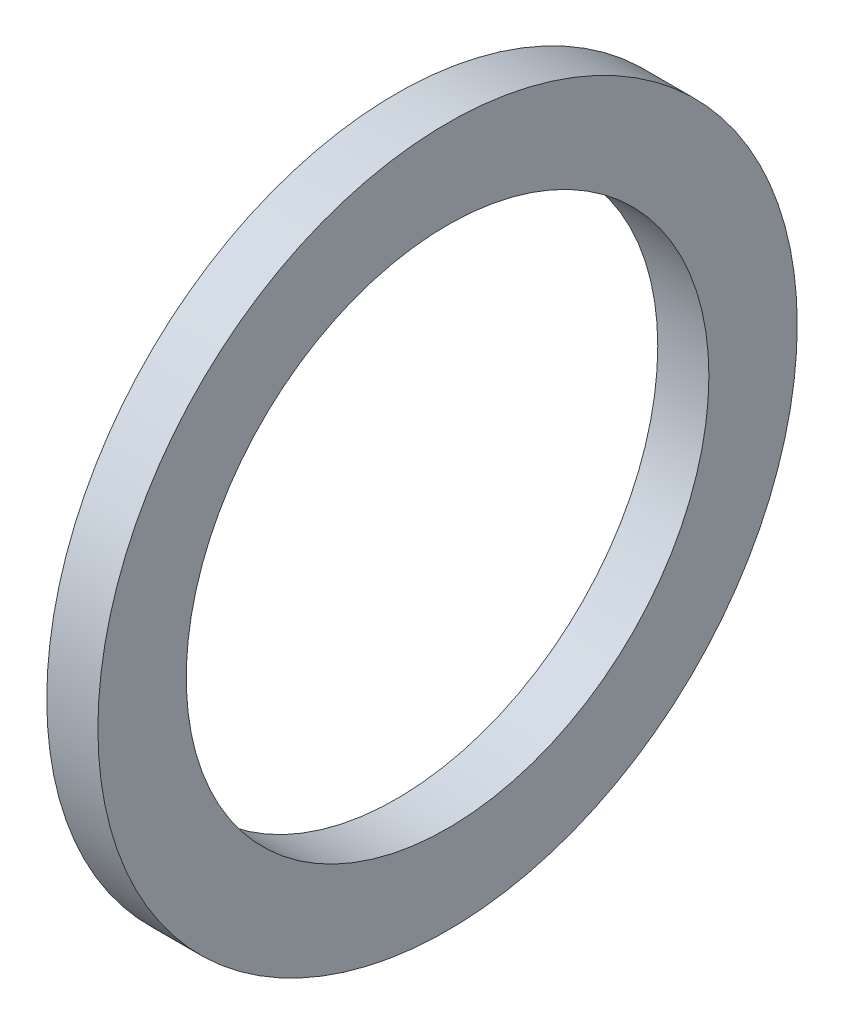
ISO-10303-21;
HEADER;
FILE_DESCRIPTION(('STEP AP214'),'2;1');
FILE_NAME('part.step','',(''),(''),'','','');
FILE_SCHEMA(('AUTOMOTIVE_DESIGN { 1 0 10303 214 1 1 1 1 }'));
ENDSEC;
DATA;
#1=APPLICATION_CONTEXT('core data for automotive mechanical design processes');
#2=APPLICATION_PROTOCOL_DEFINITION('international standard','automotive_design',2000,#1);
#3=PRODUCT_CONTEXT('',#1,'mechanical');
#4=PRODUCT('Part','Part','',(#3));
#5=PRODUCT_RELATED_PRODUCT_CATEGORY('part','',(#4));
#6=PRODUCT_DEFINITION_FORMATION('','',#4);
#7=PRODUCT_DEFINITION_CONTEXT('part definition',#1,'design');
#8=PRODUCT_DEFINITION('design','',#6,#7);
#9=PRODUCT_DEFINITION_SHAPE('','',#8);
#10=(LENGTH_UNIT() NAMED_UNIT(*) SI_UNIT(.MILLI.,.METRE.));
#11=(NAMED_UNIT(*) PLANE_ANGLE_UNIT() SI_UNIT($,.RADIAN.));
#12=(NAMED_UNIT(*) SI_UNIT($,.STERADIAN.) SOLID_ANGLE_UNIT());
#13=UNCERTAINTY_MEASURE_WITH_UNIT(LENGTH_MEASURE(1.E-05),#10,'distance_accuracy_value','');
#14=(GEOMETRIC_REPRESENTATION_CONTEXT(3) GLOBAL_UNCERTAINTY_ASSIGNED_CONTEXT((#13)) GLOBAL_UNIT_ASSIGNED_CONTEXT((#10,
#11,#12)) REPRESENTATION_CONTEXT('',''));
#15=CARTESIAN_POINT('',(0.,0.,0.));
#16=DIRECTION('',(0.,0.,1.));
#17=DIRECTION('',(1.,0.,0.));
#18=AXIS2_PLACEMENT_3D('',#15,#16,#17);
#19=CARTESIAN_POINT('',(0.79375,0.,0.));
#20=DIRECTION('',(1.,0.,0.));
#21=DIRECTION('',(0.,0.,-1.));
#22=AXIS2_PLACEMENT_3D('',#19,#20,#21);
#23=PLANE('',#22);
#24=CARTESIAN_POINT('',(0.79375,0.,0.));
#25=DIRECTION('',(1.,0.,0.));
#26=DIRECTION('',(0.,0.,-1.));
#27=AXIS2_PLACEMENT_3D('',#24,#25,#26);
#28=CIRCLE('',#27,8.1153);
#29=CARTESIAN_POINT('',(0.79375,0.,-8.1153));
#30=VERTEX_POINT('',#29);
#31=EDGE_CURVE('E26',#30,#30,#28,.F.);
#32=ORIENTED_EDGE('',*,*,#31,.T.);
#33=EDGE_LOOP('',(#32));
#34=FACE_BOUND('',#33,.T.);
#35=CARTESIAN_POINT('',(0.79375,0.,0.));
#36=DIRECTION('',(1.,0.,0.));
#37=DIRECTION('',(0.,0.,-1.));
#38=AXIS2_PLACEMENT_3D('',#35,#36,#37);
#39=CIRCLE('',#38,10.8585);
#40=CARTESIAN_POINT('',(0.79375,0.,-10.8585));
#41=VERTEX_POINT('',#40);
#42=EDGE_CURVE('E17',#41,#41,#39,.F.);
#43=ORIENTED_EDGE('',*,*,#42,.F.);
#44=EDGE_LOOP('',(#43));
#45=FACE_BOUND('',#44,.T.);
#46=ADVANCED_FACE('F14',(#34,#45),#23,.T.);
#47=CARTESIAN_POINT('',(-0.79375,0.,0.));
#48=DIRECTION('',(1.,0.,0.));
#49=DIRECTION('',(0.,0.,-1.));
#50=AXIS2_PLACEMENT_3D('',#47,#48,#49);
#51=CYLINDRICAL_SURFACE('',#50,10.8585);
#52=ORIENTED_EDGE('',*,*,#42,.T.);
#53=EDGE_LOOP('',(#52));
#54=FACE_BOUND('',#53,.T.);
#55=CARTESIAN_POINT('',(-0.79375,0.,0.));
#56=DIRECTION('',(1.,0.,0.));
#57=DIRECTION('',(0.,0.,-1.));
#58=AXIS2_PLACEMENT_3D('',#55,#56,#57);
#59=CIRCLE('',#58,10.8585);
#60=CARTESIAN_POINT('',(-0.79375,0.,-10.8585));
#61=VERTEX_POINT('',#60);
#62=EDGE_CURVE('E21',#61,#61,#59,.T.);
#63=ORIENTED_EDGE('',*,*,#62,.T.);
#64=EDGE_LOOP('',(#63));
#65=FACE_BOUND('',#64,.T.);
#66=ADVANCED_FACE('F34',(#54,#65),#51,.T.);
#67=CARTESIAN_POINT('',(-0.79375,0.,0.));
#68=DIRECTION('',(1.,0.,0.));
#69=DIRECTION('',(0.,0.,-1.));
#70=AXIS2_PLACEMENT_3D('',#67,#68,#69);
#71=CYLINDRICAL_SURFACE('',#70,8.1153);
#72=ORIENTED_EDGE('',*,*,#31,.F.);
#73=EDGE_LOOP('',(#72));
#74=FACE_BOUND('',#73,.T.);
#75=CARTESIAN_POINT('',(-0.79375,0.,0.));
#76=DIRECTION('',(1.,0.,0.));
#77=DIRECTION('',(0.,0.,-1.));
#78=AXIS2_PLACEMENT_3D('',#75,#76,#77);
#79=CIRCLE('',#78,8.1153);
#80=CARTESIAN_POINT('',(-0.79375,0.,-8.1153));
#81=VERTEX_POINT('',#80);
#82=EDGE_CURVE('E10',#81,#81,#79,.F.);
#83=ORIENTED_EDGE('',*,*,#82,.T.);
#84=EDGE_LOOP('',(#83));
#85=FACE_BOUND('',#84,.T.);
#86=ADVANCED_FACE('F42',(#74,#85),#71,.F.);
#87=CARTESIAN_POINT('',(-0.79375,0.,0.));
#88=DIRECTION('',(1.,0.,0.));
#89=DIRECTION('',(0.,0.,-1.));
#90=AXIS2_PLACEMENT_3D('',#87,#88,#89);
#91=PLANE('',#90);
#92=ORIENTED_EDGE('',*,*,#82,.F.);
#93=EDGE_LOOP('',(#92));
#94=FACE_BOUND('',#93,.T.);
#95=ORIENTED_EDGE('',*,*,#62,.F.);
#96=EDGE_LOOP('',(#95));
#97=FACE_BOUND('',#96,.T.);
#98=ADVANCED_FACE('F43',(#94,#97),#91,.F.);
#99=CLOSED_SHELL('',(#46,#66,#86,#98));
#100=MANIFOLD_SOLID_BREP('B1',#99);
#101=ADVANCED_BREP_SHAPE_REPRESENTATION('',(#18,#100),#14);
#102=SHAPE_DEFINITION_REPRESENTATION(#9,#101);
ENDSEC;
END-ISO-10303-21;
